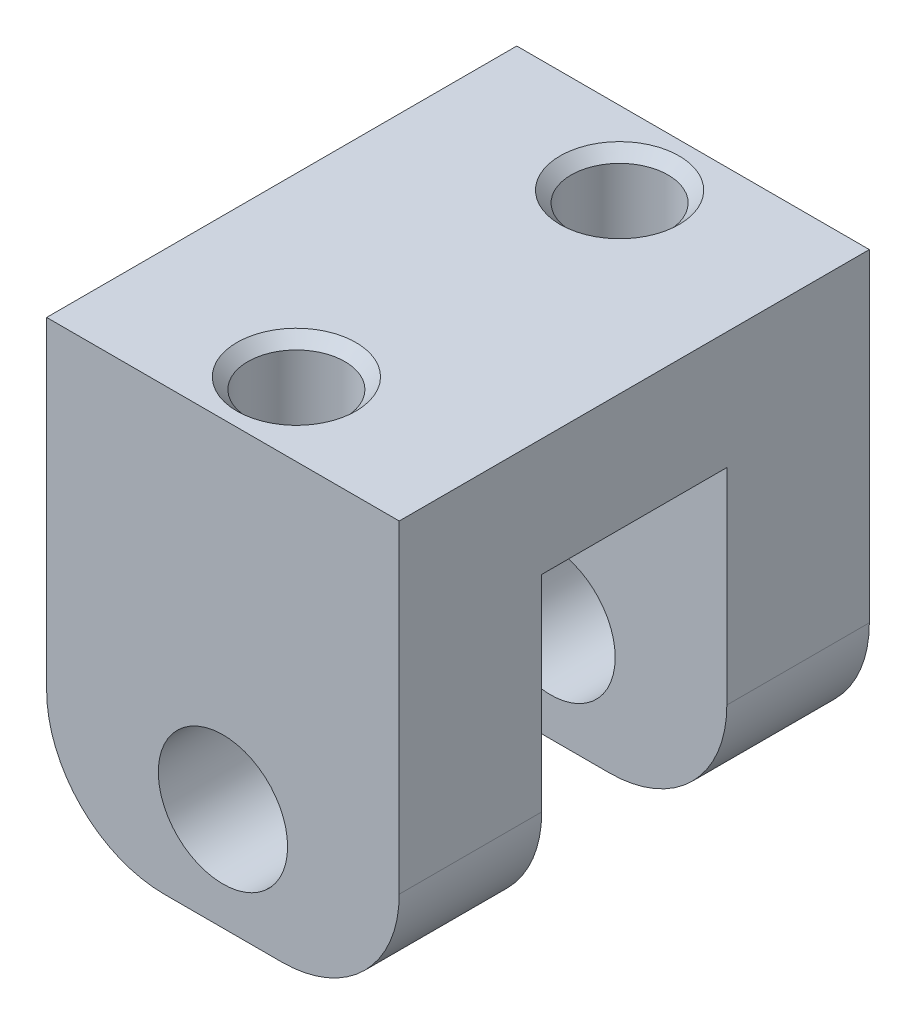
ISO-10303-21;
HEADER;
FILE_DESCRIPTION(('STEP AP214'),'2;1');
FILE_NAME('part.step','',(''),(''),'','','');
FILE_SCHEMA(('AUTOMOTIVE_DESIGN { 1 0 10303 214 1 1 1 1 }'));
ENDSEC;
DATA;
#1=APPLICATION_CONTEXT('core data for automotive mechanical design processes');
#2=APPLICATION_PROTOCOL_DEFINITION('international standard','automotive_design',2000,#1);
#3=PRODUCT_CONTEXT('',#1,'mechanical');
#4=PRODUCT('Part','Part','',(#3));
#5=PRODUCT_RELATED_PRODUCT_CATEGORY('part','',(#4));
#6=PRODUCT_DEFINITION_FORMATION('','',#4);
#7=PRODUCT_DEFINITION_CONTEXT('part definition',#1,'design');
#8=PRODUCT_DEFINITION('design','',#6,#7);
#9=PRODUCT_DEFINITION_SHAPE('','',#8);
#10=(LENGTH_UNIT() NAMED_UNIT(*) SI_UNIT(.MILLI.,.METRE.));
#11=(NAMED_UNIT(*) PLANE_ANGLE_UNIT() SI_UNIT($,.RADIAN.));
#12=(NAMED_UNIT(*) SI_UNIT($,.STERADIAN.) SOLID_ANGLE_UNIT());
#13=UNCERTAINTY_MEASURE_WITH_UNIT(LENGTH_MEASURE(1.E-05),#10,'distance_accuracy_value','');
#14=(GEOMETRIC_REPRESENTATION_CONTEXT(3) GLOBAL_UNCERTAINTY_ASSIGNED_CONTEXT((#13)) GLOBAL_UNIT_ASSIGNED_CONTEXT((#10,
#11,#12)) REPRESENTATION_CONTEXT('',''));
#15=CARTESIAN_POINT('',(0.,0.,0.));
#16=DIRECTION('',(0.,0.,1.));
#17=DIRECTION('',(1.,0.,0.));
#18=AXIS2_PLACEMENT_3D('',#15,#16,#17);
#19=CARTESIAN_POINT('',(2.,4.,8.));
#20=DIRECTION('',(0.,0.,-1.));
#21=DIRECTION('',(-1.,0.,0.));
#22=AXIS2_PLACEMENT_3D('',#19,#20,#21);
#23=CYLINDRICAL_SURFACE('',#22,4.);
#24=CARTESIAN_POINT('',(2.,4.,-3.15));
#25=DIRECTION('',(0.,0.,1.));
#26=DIRECTION('',(0.,1.,0.));
#27=AXIS2_PLACEMENT_3D('',#24,#25,#26);
#28=CIRCLE('',#27,4.);
#29=CARTESIAN_POINT('',(2.,0.,-3.15));
#30=VERTEX_POINT('',#29);
#31=CARTESIAN_POINT('',(6.,4.,-3.15));
#32=VERTEX_POINT('',#31);
#33=EDGE_CURVE('E164',#30,#32,#28,.T.);
#34=ORIENTED_EDGE('',*,*,#33,.F.);
#35=DIRECTION('',(0.,0.,1.));
#36=VECTOR('',#35,1.);
#37=CARTESIAN_POINT('',(2.,0.,0.));
#38=LINE('',#37,#36);
#39=CARTESIAN_POINT('',(2.,0.,-8.));
#40=VERTEX_POINT('',#39);
#41=EDGE_CURVE('E240',#40,#30,#38,.T.);
#42=ORIENTED_EDGE('',*,*,#41,.F.);
#43=CARTESIAN_POINT('',(2.,4.,-8.));
#44=DIRECTION('',(0.,0.,-1.));
#45=DIRECTION('',(1.,0.,0.));
#46=AXIS2_PLACEMENT_3D('',#43,#44,#45);
#47=CIRCLE('',#46,4.);
#48=CARTESIAN_POINT('',(6.,4.,-8.));
#49=VERTEX_POINT('',#48);
#50=EDGE_CURVE('E286',#49,#40,#47,.T.);
#51=ORIENTED_EDGE('',*,*,#50,.F.);
#52=DIRECTION('',(0.,0.,-1.));
#53=VECTOR('',#52,1.);
#54=CARTESIAN_POINT('',(6.,4.,8.));
#55=LINE('',#54,#53);
#56=EDGE_CURVE('E310',#32,#49,#55,.T.);
#57=ORIENTED_EDGE('',*,*,#56,.F.);
#58=EDGE_LOOP('',(#34,#42,#51,#57));
#59=FACE_BOUND('',#58,.T.);
#60=ADVANCED_FACE('F17',(#59),#23,.T.);
#61=CARTESIAN_POINT('',(2.,4.,8.));
#62=DIRECTION('',(0.,0.,-1.));
#63=DIRECTION('',(-1.,0.,0.));
#64=AXIS2_PLACEMENT_3D('',#61,#62,#63);
#65=CYLINDRICAL_SURFACE('',#64,4.);
#66=CARTESIAN_POINT('',(2.,4.,8.));
#67=DIRECTION('',(0.,0.,1.));
#68=DIRECTION('',(-1.,0.,0.));
#69=AXIS2_PLACEMENT_3D('',#66,#67,#68);
#70=CIRCLE('',#69,4.);
#71=CARTESIAN_POINT('',(2.,0.,8.));
#72=VERTEX_POINT('',#71);
#73=CARTESIAN_POINT('',(6.,4.,8.));
#74=VERTEX_POINT('',#73);
#75=EDGE_CURVE('E331',#72,#74,#70,.T.);
#76=ORIENTED_EDGE('',*,*,#75,.F.);
#77=DIRECTION('',(0.,0.,1.));
#78=VECTOR('',#77,1.);
#79=CARTESIAN_POINT('',(2.,0.,0.));
#80=LINE('',#79,#78);
#81=CARTESIAN_POINT('',(2.,0.,3.15));
#82=VERTEX_POINT('',#81);
#83=EDGE_CURVE('E372',#82,#72,#80,.T.);
#84=ORIENTED_EDGE('',*,*,#83,.F.);
#85=CARTESIAN_POINT('',(2.,4.,3.15));
#86=DIRECTION('',(0.,0.,-1.));
#87=DIRECTION('',(1.,0.,0.));
#88=AXIS2_PLACEMENT_3D('',#85,#86,#87);
#89=CIRCLE('',#88,4.);
#90=CARTESIAN_POINT('',(6.,4.,3.15));
#91=VERTEX_POINT('',#90);
#92=EDGE_CURVE('E262',#91,#82,#89,.T.);
#93=ORIENTED_EDGE('',*,*,#92,.F.);
#94=DIRECTION('',(0.,0.,-1.));
#95=VECTOR('',#94,1.);
#96=CARTESIAN_POINT('',(6.,4.,8.));
#97=LINE('',#96,#95);
#98=EDGE_CURVE('E323',#74,#91,#97,.T.);
#99=ORIENTED_EDGE('',*,*,#98,.F.);
#100=EDGE_LOOP('',(#76,#84,#93,#99));
#101=FACE_BOUND('',#100,.T.);
#102=ADVANCED_FACE('F19',(#101),#65,.T.);
#103=CARTESIAN_POINT('',(-2.,4.,8.));
#104=DIRECTION('',(0.,0.,1.));
#105=DIRECTION('',(1.,0.,0.));
#106=AXIS2_PLACEMENT_3D('',#103,#104,#105);
#107=CYLINDRICAL_SURFACE('',#106,4.);
#108=CARTESIAN_POINT('',(-2.,4.,-8.));
#109=DIRECTION('',(0.,0.,-1.));
#110=DIRECTION('',(1.,0.,0.));
#111=AXIS2_PLACEMENT_3D('',#108,#109,#110);
#112=CIRCLE('',#111,4.);
#113=CARTESIAN_POINT('',(-2.,0.,-8.));
#114=VERTEX_POINT('',#113);
#115=CARTESIAN_POINT('',(-6.,4.,-8.));
#116=VERTEX_POINT('',#115);
#117=EDGE_CURVE('E293',#114,#116,#112,.T.);
#118=ORIENTED_EDGE('',*,*,#117,.F.);
#119=DIRECTION('',(0.,0.,-1.));
#120=VECTOR('',#119,1.);
#121=CARTESIAN_POINT('',(-2.,0.,0.));
#122=LINE('',#121,#120);
#123=CARTESIAN_POINT('',(-2.,0.,-3.15));
#124=VERTEX_POINT('',#123);
#125=EDGE_CURVE('E239',#124,#114,#122,.T.);
#126=ORIENTED_EDGE('',*,*,#125,.F.);
#127=CARTESIAN_POINT('',(-2.,4.,-3.15));
#128=DIRECTION('',(0.,0.,1.));
#129=DIRECTION('',(0.,1.,0.));
#130=AXIS2_PLACEMENT_3D('',#127,#128,#129);
#131=CIRCLE('',#130,4.);
#132=CARTESIAN_POINT('',(-6.,4.,-3.15));
#133=VERTEX_POINT('',#132);
#134=EDGE_CURVE('E268',#133,#124,#131,.T.);
#135=ORIENTED_EDGE('',*,*,#134,.F.);
#136=DIRECTION('',(0.,0.,1.));
#137=VECTOR('',#136,1.);
#138=CARTESIAN_POINT('',(-6.,4.,8.));
#139=LINE('',#138,#137);
#140=EDGE_CURVE('E345',#116,#133,#139,.T.);
#141=ORIENTED_EDGE('',*,*,#140,.F.);
#142=EDGE_LOOP('',(#118,#126,#135,#141));
#143=FACE_BOUND('',#142,.T.);
#144=ADVANCED_FACE('F192',(#143),#107,.T.);
#145=CARTESIAN_POINT('',(-2.,4.,8.));
#146=DIRECTION('',(0.,0.,1.));
#147=DIRECTION('',(1.,0.,0.));
#148=AXIS2_PLACEMENT_3D('',#145,#146,#147);
#149=CYLINDRICAL_SURFACE('',#148,4.);
#150=CARTESIAN_POINT('',(-2.,4.,3.15));
#151=DIRECTION('',(0.,0.,-1.));
#152=DIRECTION('',(1.,0.,0.));
#153=AXIS2_PLACEMENT_3D('',#150,#151,#152);
#154=CIRCLE('',#153,4.);
#155=CARTESIAN_POINT('',(-2.,0.,3.15));
#156=VERTEX_POINT('',#155);
#157=CARTESIAN_POINT('',(-6.,4.,3.15));
#158=VERTEX_POINT('',#157);
#159=EDGE_CURVE('E255',#156,#158,#154,.T.);
#160=ORIENTED_EDGE('',*,*,#159,.F.);
#161=DIRECTION('',(0.,0.,-1.));
#162=VECTOR('',#161,1.);
#163=CARTESIAN_POINT('',(-2.,0.,0.));
#164=LINE('',#163,#162);
#165=CARTESIAN_POINT('',(-2.,0.,8.));
#166=VERTEX_POINT('',#165);
#167=EDGE_CURVE('E377',#166,#156,#164,.T.);
#168=ORIENTED_EDGE('',*,*,#167,.F.);
#169=CARTESIAN_POINT('',(-2.,4.,8.));
#170=DIRECTION('',(0.,0.,1.));
#171=DIRECTION('',(-1.,0.,0.));
#172=AXIS2_PLACEMENT_3D('',#169,#170,#171);
#173=CIRCLE('',#172,4.);
#174=CARTESIAN_POINT('',(-6.,4.,8.));
#175=VERTEX_POINT('',#174);
#176=EDGE_CURVE('E336',#175,#166,#173,.T.);
#177=ORIENTED_EDGE('',*,*,#176,.F.);
#178=DIRECTION('',(0.,0.,1.));
#179=VECTOR('',#178,1.);
#180=CARTESIAN_POINT('',(-6.,4.,8.));
#181=LINE('',#180,#179);
#182=EDGE_CURVE('E358',#158,#175,#181,.T.);
#183=ORIENTED_EDGE('',*,*,#182,.F.);
#184=EDGE_LOOP('',(#160,#168,#177,#183));
#185=FACE_BOUND('',#184,.T.);
#186=ADVANCED_FACE('F189',(#185),#149,.T.);
#187=CARTESIAN_POINT('',(0.,3.5,-8.));
#188=DIRECTION('',(0.,0.,1.));
#189=DIRECTION('',(1.,0.,0.));
#190=AXIS2_PLACEMENT_3D('',#187,#188,#189);
#191=CYLINDRICAL_SURFACE('',#190,2.2);
#192=CARTESIAN_POINT('',(0.,5.7,7.15));
#193=CARTESIAN_POINT('',(-0.0805428094252697,5.69999494216035,7.14999472878677));
#194=CARTESIAN_POINT('',(-0.161217168223633,5.69553010078902,7.14405447318805));
#195=CARTESIAN_POINT('',(-0.320030035915113,5.67807268009191,7.12066623024882));
#196=CARTESIAN_POINT('',(-0.398161649851904,5.66505866147839,7.10318931118494));
#197=CARTESIAN_POINT('',(-0.549158089294374,5.63175242451666,7.05791579978785));
#198=CARTESIAN_POINT('',(-0.622051776944111,5.6115044712521,7.03018193507391));
#199=CARTESIAN_POINT('',(-0.761664569072828,5.56525612393863,6.96570342139405));
#200=CARTESIAN_POINT('',(-0.828385471975964,5.53925741289031,6.92896140838713));
#201=CARTESIAN_POINT('',(-0.960812531349158,5.48054498998381,6.8439106872501));
#202=CARTESIAN_POINT('',(-1.02585255219924,5.44743239403283,6.79484593773252));
#203=CARTESIAN_POINT('',(-1.14732988444438,5.37843719671715,6.68855457890271));
#204=CARTESIAN_POINT('',(-1.20375363099448,5.34255035886469,6.63131536892018));
#205=CARTESIAN_POINT('',(-1.31820877580285,5.26298236017189,6.49705875139379));
#206=CARTESIAN_POINT('',(-1.37423636263325,5.21919940351103,6.41838595516612));
#207=CARTESIAN_POINT('',(-1.47248197993983,5.13582589130549,6.2508038863968));
#208=CARTESIAN_POINT('',(-1.51471888681385,5.09622965572043,6.16190883329966));
#209=CARTESIAN_POINT('',(-1.57168690592967,5.03974870698196,6.00654687745615));
#210=CARTESIAN_POINT('',(-1.59088241902193,5.01973526305407,5.94287023315878));
#211=CARTESIAN_POINT('',(-1.62162739821328,4.98688753565754,5.81196799173659));
#212=CARTESIAN_POINT('',(-1.63319436890794,4.97403682701915,5.74475090433773));
#213=CARTESIAN_POINT('',(-1.6479410435559,4.95754135653008,5.60759915591615));
#214=CARTESIAN_POINT('',(-1.65104450339628,4.95398029344257,5.53764551260354));
#215=CARTESIAN_POINT('',(-1.64833034566055,4.95705484953675,5.39812359803027));
#216=CARTESIAN_POINT('',(-1.64250952973084,4.96369412439925,5.32855547390382));
#217=CARTESIAN_POINT('',(-1.6235751322107,4.98464385588771,5.19948951783163));
#218=CARTESIAN_POINT('',(-1.61130735018898,4.99805872765858,5.13970999184919));
#219=CARTESIAN_POINT('',(-1.58076238232806,5.03025612129433,5.02321723340703));
#220=CARTESIAN_POINT('',(-1.56247942049289,5.04904380004846,4.96650700939404));
#221=CARTESIAN_POINT('',(-1.50736370589787,5.10315946223738,4.82211797470243));
#222=CARTESIAN_POINT('',(-1.46608163343378,5.14148214053156,4.73725954169213));
#223=CARTESIAN_POINT('',(-1.37079825645971,5.22186627959716,4.576883823744));
#224=CARTESIAN_POINT('',(-1.31676604681466,5.26393666774721,4.50138992681987));
#225=CARTESIAN_POINT('',(-1.19516764512349,5.3485683954446,4.35847127055598));
#226=CARTESIAN_POINT('',(-1.1272951307864,5.39111545403264,4.29129733243037));
#227=CARTESIAN_POINT('',(-0.979464773880545,5.4717284177907,4.16870998854072));
#228=CARTESIAN_POINT('',(-0.899530559723128,5.50980283090136,4.11327408774659));
#229=CARTESIAN_POINT('',(-0.745692288499553,5.57107698681008,4.02602112083563));
#230=CARTESIAN_POINT('',(-0.67379385720418,5.59572848039509,3.99169694636264));
#231=CARTESIAN_POINT('',(-0.523987390522293,5.63810194858642,3.93335263148975));
#232=CARTESIAN_POINT('',(-0.44608315517014,5.65582826254787,3.90932603765079));
#233=CARTESIAN_POINT('',(-0.285643855731867,5.68290147499588,3.87282130082492));
#234=CARTESIAN_POINT('',(-0.203083409546535,5.69219652268924,3.86041460316751));
#235=CARTESIAN_POINT('',(-0.0365213637766071,5.70127472025389,3.84829544289112));
#236=CARTESIAN_POINT('',(0.0474796128099975,5.70106188329949,3.8485776244351));
#237=CARTESIAN_POINT('',(0.205484639062589,5.69166801893461,3.86112195620051));
#238=CARTESIAN_POINT('',(0.279644560300747,5.68339095260441,3.87217659057754));
#239=CARTESIAN_POINT('',(0.424721737670031,5.65986452221747,3.90387115800865));
#240=CARTESIAN_POINT('',(0.495638300285988,5.64461367457988,3.92451313065835));
#241=CARTESIAN_POINT('',(0.635158457658748,5.60759813751645,3.97527628365241));
#242=CARTESIAN_POINT('',(0.703592089789755,5.58562255319213,4.00570629957014));
#243=CARTESIAN_POINT('',(0.834370379747382,5.53683683953159,4.07458970096815));
#244=CARTESIAN_POINT('',(0.896714193470045,5.51002604145275,4.11304419640371));
#245=CARTESIAN_POINT('',(1.02466278895094,5.44831061575149,4.20396157105162));
#246=CARTESIAN_POINT('',(1.08907343896857,5.41280204527541,4.2576913933812));
#247=CARTESIAN_POINT('',(1.20859172341439,5.33962848162263,4.37360962784723));
#248=CARTESIAN_POINT('',(1.26367813516534,5.30195882358135,4.4358167696627));
#249=CARTESIAN_POINT('',(1.37365295183189,5.22006041120647,4.5805648690573));
#250=CARTESIAN_POINT('',(1.42651348013576,5.17594590372111,4.66472331764153));
#251=CARTESIAN_POINT('',(1.51715559598111,5.09434650483295,4.8436960857697));
#252=CARTESIAN_POINT('',(1.5549820056707,5.05684209528066,4.93847763409943));
#253=CARTESIAN_POINT('',(1.60177307682444,5.00830765589441,5.09895589376193));
#254=CARTESIAN_POINT('',(1.61624110464295,4.99265393007021,5.16163023904262));
#255=CARTESIAN_POINT('',(1.63780674400097,4.96896261713312,5.2895777516815));
#256=CARTESIAN_POINT('',(1.64492080719163,4.96090803342257,5.35484477748248));
#257=CARTESIAN_POINT('',(1.6512685222997,4.9537336197143,5.48661198779246));
#258=CARTESIAN_POINT('',(1.65046216857788,4.95465914753473,5.55311673731053));
#259=CARTESIAN_POINT('',(1.64094572222041,4.96538093398033,5.68486252262738));
#260=CARTESIAN_POINT('',(1.63222543027043,4.97518863973232,5.75010181668699));
#261=CARTESIAN_POINT('',(1.60483226001695,5.0049908367755,5.89150602855188));
#262=CARTESIAN_POINT('',(1.58440224749522,5.02674176545708,5.96694689814606));
#263=CARTESIAN_POINT('',(1.5341658999273,5.07721259723951,6.11218833371354));
#264=CARTESIAN_POINT('',(1.50433588027502,5.10595006161623,6.18197408624201));
#265=CARTESIAN_POINT('',(1.42448810827006,5.17768125061707,6.33877269353497));
#266=CARTESIAN_POINT('',(1.37105696272567,5.22216223510216,6.42336374103133));
#267=CARTESIAN_POINT('',(1.2501579031253,5.311848611994,6.58143864947532));
#268=CARTESIAN_POINT('',(1.18267748234434,5.35705461649645,6.65491251253933));
#269=CARTESIAN_POINT('',(1.03358985943167,5.44401887833773,6.79011502651166));
#270=CARTESIAN_POINT('',(0.951870877719142,5.48574567082179,6.85174195131492));
#271=CARTESIAN_POINT('',(0.77567500882982,5.56093018634907,6.95994535625989));
#272=CARTESIAN_POINT('',(0.681229362441967,5.59440760752255,7.00655777202975));
#273=CARTESIAN_POINT('',(0.511324319392093,5.64100375086453,7.07057936308428));
#274=CARTESIAN_POINT('',(0.4384089762522,5.6572135474969,7.0925434045138));
#275=CARTESIAN_POINT('',(0.289125771432031,5.68222113967262,7.12625969287264));
#276=CARTESIAN_POINT('',(0.21276818621839,5.69103963331984,7.13804045927495));
#277=CARTESIAN_POINT('',(0.113259640848073,5.6972001887694,7.14626516363578));
#278=CARTESIAN_POINT('',(0.0906476405935323,5.69824837575288,7.14766390523836));
#279=CARTESIAN_POINT('',(0.0453605785868143,5.69964904965452,7.14953214055407));
#280=CARTESIAN_POINT('',(0.022685507271226,5.70000142457979,7.15000148467811));
#281=CARTESIAN_POINT('',(0.,5.7,7.15));
#282=B_SPLINE_CURVE_WITH_KNOTS('',3,(#192,#193,#194,#195,#196,#197,#198,#199,#200,#201,#202,
#203,#204,#205,#206,#207,#208,#209,#210,#211,#212,#213,#214,#215,#216,#217,#218,#219,#220,#221,
#222,#223,#224,#225,#226,#227,#228,#229,#230,#231,#232,#233,#234,#235,#236,#237,#238,#239,#240,
#241,#242,#243,#244,#245,#246,#247,#248,#249,#250,#251,#252,#253,#254,#255,#256,#257,#258,#259,
#260,#261,#262,#263,#264,#265,#266,#267,#268,#269,#270,#271,#272,#273,#274,#275,#276,#277,#278,
#279,#280,#281),.UNSPECIFIED.,.T.,.F.,(4,2,2,2,2,2,2,2,2,2,2,2,2,2,2,2,2,2,2,2,2,2,2,2,2,2,2,2,
2,2,2,2,2,2,2,2,2,2,2,2,2,2,2,2,4),(0.,0.241528965229246,0.483665951365568,0.724345966930719,
0.964955638734221,1.22784674449173,1.49114755245679,1.80796017476196,2.12433731462157,
2.33199470382891,2.53917392514819,2.74821346383383,2.95732793730231,3.1440957917898,
3.33104351360704,3.63494264986501,3.93958611593678,4.251894723319,4.5635992874306,
4.81279155507028,5.06182742607429,5.31238463983588,5.56283609713274,5.78810305713193,
6.01341796204393,6.24668483432048,6.47998399375295,6.75224420290054,7.02511599883996,
7.34985455617541,7.67361755435123,7.87148077565225,8.06890039025628,8.26731767240215,
8.46599103420239,8.70803638056148,8.95069653653913,9.27753471321344,9.60466509629982,
9.93448994441914,10.2635194230048,10.4961526729579,10.7281322751158,10.7961498356658,
10.8641783429406),.UNSPECIFIED.);
#283=CARTESIAN_POINT('',(0.,5.7,7.15));
#284=VERTEX_POINT('',#283);
#285=EDGE_CURVE('E21',#284,#284,#282,.T.);
#286=ORIENTED_EDGE('',*,*,#285,.F.);
#287=EDGE_LOOP('',(#286));
#288=FACE_BOUND('',#287,.T.);
#289=CARTESIAN_POINT('',(0.,3.5,8.));
#290=DIRECTION('',(0.,0.,1.));
#291=DIRECTION('',(1.,0.,0.));
#292=AXIS2_PLACEMENT_3D('',#289,#290,#291);
#293=CIRCLE('',#292,2.2);
#294=CARTESIAN_POINT('',(2.2,3.5,8.));
#295=VERTEX_POINT('',#294);
#296=EDGE_CURVE('E327',#295,#295,#293,.T.);
#297=ORIENTED_EDGE('',*,*,#296,.T.);
#298=EDGE_LOOP('',(#297));
#299=FACE_BOUND('',#298,.T.);
#300=CARTESIAN_POINT('',(0.,3.5,3.15));
#301=DIRECTION('',(0.,0.,1.));
#302=DIRECTION('',(1.,0.,0.));
#303=AXIS2_PLACEMENT_3D('',#300,#301,#302);
#304=CIRCLE('',#303,2.2);
#305=CARTESIAN_POINT('',(2.2,3.5,3.15));
#306=VERTEX_POINT('',#305);
#307=EDGE_CURVE('E265',#306,#306,#304,.T.);
#308=ORIENTED_EDGE('',*,*,#307,.F.);
#309=EDGE_LOOP('',(#308));
#310=FACE_BOUND('',#309,.T.);
#311=ADVANCED_FACE('F182',(#288,#299,#310),#191,.F.);
#312=CARTESIAN_POINT('',(0.,3.5,-8.));
#313=DIRECTION('',(0.,0.,1.));
#314=DIRECTION('',(1.,0.,0.));
#315=AXIS2_PLACEMENT_3D('',#312,#313,#314);
#316=CYLINDRICAL_SURFACE('',#315,2.2);
#317=CARTESIAN_POINT('',(0.,5.7,-3.85));
#318=CARTESIAN_POINT('',(-0.0805428094252718,5.69999494216035,-3.85000527121323));
#319=CARTESIAN_POINT('',(-0.161217168223636,5.69553010078902,-3.85594552681195));
#320=CARTESIAN_POINT('',(-0.320030035915116,5.67807268009191,-3.87933376975118));
#321=CARTESIAN_POINT('',(-0.398161649851906,5.66505866147839,-3.89681068881506));
#322=CARTESIAN_POINT('',(-0.549158089294376,5.63175242451666,-3.94208420021215));
#323=CARTESIAN_POINT('',(-0.622051776944113,5.6115044712521,-3.96981806492609));
#324=CARTESIAN_POINT('',(-0.761664569072831,5.56525612393863,-4.03429657860595));
#325=CARTESIAN_POINT('',(-0.828385471975967,5.53925741289031,-4.07103859161287));
#326=CARTESIAN_POINT('',(-0.960812531349161,5.48054498998381,-4.1560893127499));
#327=CARTESIAN_POINT('',(-1.02585255219924,5.44743239403283,-4.20515406226748));
#328=CARTESIAN_POINT('',(-1.14732988444438,5.37843719671715,-4.31144542109729));
#329=CARTESIAN_POINT('',(-1.20375363099448,5.34255035886469,-4.36868463107982));
#330=CARTESIAN_POINT('',(-1.31820877580285,5.26298236017189,-4.50294124860621));
#331=CARTESIAN_POINT('',(-1.37423636263325,5.21919940351102,-4.58161404483387));
#332=CARTESIAN_POINT('',(-1.47248197993983,5.13582589130548,-4.7491961136032));
#333=CARTESIAN_POINT('',(-1.51471888681384,5.09622965572043,-4.83809116670034));
#334=CARTESIAN_POINT('',(-1.57168690592967,5.03974870698196,-4.99345312254385));
#335=CARTESIAN_POINT('',(-1.59088241902193,5.01973526305407,-5.05712976684122));
#336=CARTESIAN_POINT('',(-1.62162739821329,4.98688753565753,-5.18803200826341));
#337=CARTESIAN_POINT('',(-1.63319436890794,4.97403682701914,-5.25524909566227));
#338=CARTESIAN_POINT('',(-1.6479410435559,4.95754135653008,-5.39240084408385));
#339=CARTESIAN_POINT('',(-1.65104450339628,4.95398029344256,-5.46235448739646));
#340=CARTESIAN_POINT('',(-1.64833034566056,4.95705484953675,-5.60187640196973));
#341=CARTESIAN_POINT('',(-1.64250952973084,4.96369412439924,-5.67144452609618));
#342=CARTESIAN_POINT('',(-1.6235751322107,4.9846438558877,-5.80051048216837));
#343=CARTESIAN_POINT('',(-1.61130735018899,4.99805872765858,-5.8602900081508));
#344=CARTESIAN_POINT('',(-1.58076238232806,5.03025612129433,-5.97678276659296));
#345=CARTESIAN_POINT('',(-1.56247942049289,5.04904380004845,-6.03349299060595));
#346=CARTESIAN_POINT('',(-1.50736370589788,5.10315946223736,-6.17788202529756));
#347=CARTESIAN_POINT('',(-1.46608163343378,5.14148214053156,-6.26274045830786));
#348=CARTESIAN_POINT('',(-1.37079825645971,5.22186627959715,-6.42311617625599));
#349=CARTESIAN_POINT('',(-1.31676604681466,5.2639366677472,-6.49861007318012));
#350=CARTESIAN_POINT('',(-1.19516764512349,5.34856839544459,-6.64152872944402));
#351=CARTESIAN_POINT('',(-1.1272951307864,5.39111545403263,-6.70870266756963));
#352=CARTESIAN_POINT('',(-0.979464773880552,5.4717284177907,-6.83129001145928));
#353=CARTESIAN_POINT('',(-0.899530559723134,5.50980283090136,-6.88672591225341));
#354=CARTESIAN_POINT('',(-0.745692288499558,5.57107698681007,-6.97397887916436));
#355=CARTESIAN_POINT('',(-0.673793857204185,5.59572848039509,-7.00830305363736));
#356=CARTESIAN_POINT('',(-0.523987390522299,5.63810194858642,-7.06664736851025));
#357=CARTESIAN_POINT('',(-0.446083155170146,5.65582826254787,-7.09067396234921));
#358=CARTESIAN_POINT('',(-0.285643855731872,5.68290147499588,-7.12717869917508));
#359=CARTESIAN_POINT('',(-0.203083409546539,5.69219652268924,-7.13958539683249));
#360=CARTESIAN_POINT('',(-0.0365213637766114,5.70127472025389,-7.15170455710888));
#361=CARTESIAN_POINT('',(0.047479612809993,5.70106188329949,-7.1514223755649));
#362=CARTESIAN_POINT('',(0.205484639062585,5.69166801893461,-7.13887804379949));
#363=CARTESIAN_POINT('',(0.279644560300743,5.68339095260441,-7.12782340942246));
#364=CARTESIAN_POINT('',(0.424721737670026,5.65986452221746,-7.09612884199135));
#365=CARTESIAN_POINT('',(0.495638300285983,5.64461367457988,-7.07548686934165));
#366=CARTESIAN_POINT('',(0.635158457658743,5.60759813751645,-7.02472371634759));
#367=CARTESIAN_POINT('',(0.70359208978975,5.58562255319213,-6.99429370042987));
#368=CARTESIAN_POINT('',(0.834370379747378,5.53683683953159,-6.92541029903185));
#369=CARTESIAN_POINT('',(0.89671419347004,5.51002604145275,-6.88695580359629));
#370=CARTESIAN_POINT('',(1.02466278895094,5.44831061575149,-6.79603842894838));
#371=CARTESIAN_POINT('',(1.08907343896857,5.41280204527541,-6.7423086066188));
#372=CARTESIAN_POINT('',(1.20859172341439,5.33962848162263,-6.62639037215277));
#373=CARTESIAN_POINT('',(1.26367813516534,5.30195882358135,-6.5641832303373));
#374=CARTESIAN_POINT('',(1.37365295183188,5.22006041120647,-6.4194351309427));
#375=CARTESIAN_POINT('',(1.42651348013575,5.17594590372111,-6.33527668235847));
#376=CARTESIAN_POINT('',(1.51715559598111,5.09434650483296,-6.1563039142303));
#377=CARTESIAN_POINT('',(1.55498200567071,5.05684209528067,-6.06152236590057));
#378=CARTESIAN_POINT('',(1.60177307682444,5.00830765589442,-5.90104410623807));
#379=CARTESIAN_POINT('',(1.61624110464295,4.99265393007022,-5.83836976095738));
#380=CARTESIAN_POINT('',(1.63780674400097,4.96896261713312,-5.7104222483185));
#381=CARTESIAN_POINT('',(1.64492080719163,4.96090803342257,-5.64515522251752));
#382=CARTESIAN_POINT('',(1.6512685222997,4.9537336197143,-5.51338801220754));
#383=CARTESIAN_POINT('',(1.65046216857788,4.95465914753473,-5.44688326268947));
#384=CARTESIAN_POINT('',(1.64094572222041,4.96538093398033,-5.31513747737262));
#385=CARTESIAN_POINT('',(1.63222543027042,4.97518863973232,-5.24989818331301));
#386=CARTESIAN_POINT('',(1.60483226001694,5.0049908367755,-5.10849397144812));
#387=CARTESIAN_POINT('',(1.58440224749522,5.02674176545708,-5.03305310185394));
#388=CARTESIAN_POINT('',(1.5341658999273,5.07721259723951,-4.88781166628647));
#389=CARTESIAN_POINT('',(1.50433588027502,5.10595006161623,-4.81802591375799));
#390=CARTESIAN_POINT('',(1.42448810827006,5.17768125061707,-4.66122730646503));
#391=CARTESIAN_POINT('',(1.37105696272567,5.22216223510216,-4.57663625896867));
#392=CARTESIAN_POINT('',(1.2501579031253,5.311848611994,-4.41856135052468));
#393=CARTESIAN_POINT('',(1.18267748234435,5.35705461649645,-4.34508748746067));
#394=CARTESIAN_POINT('',(1.03358985943168,5.44401887833773,-4.20988497348834));
#395=CARTESIAN_POINT('',(0.951870877719143,5.48574567082179,-4.14825804868508));
#396=CARTESIAN_POINT('',(0.77567500882982,5.56093018634907,-4.04005464374011));
#397=CARTESIAN_POINT('',(0.681229362441969,5.59440760752255,-3.99344222797025));
#398=CARTESIAN_POINT('',(0.511324319392095,5.64100375086453,-3.92942063691572));
#399=CARTESIAN_POINT('',(0.438408976252202,5.6572135474969,-3.90745659548621));
#400=CARTESIAN_POINT('',(0.289125771432032,5.68222113967262,-3.87374030712736));
#401=CARTESIAN_POINT('',(0.212768186218392,5.69103963331984,-3.86195954072504));
#402=CARTESIAN_POINT('',(0.113259640848074,5.6972001887694,-3.85373483636422));
#403=CARTESIAN_POINT('',(0.0906476405935326,5.69824837575288,-3.85233609476164));
#404=CARTESIAN_POINT('',(0.0453605785868134,5.69964904965452,-3.85046785944593));
#405=CARTESIAN_POINT('',(0.0226855072712245,5.70000142457979,-3.84999851532189));
#406=CARTESIAN_POINT('',(0.,5.7,-3.85));
#407=B_SPLINE_CURVE_WITH_KNOTS('',3,(#317,#318,#319,#320,#321,#322,#323,#324,#325,#326,#327,
#328,#329,#330,#331,#332,#333,#334,#335,#336,#337,#338,#339,#340,#341,#342,#343,#344,#345,#346,
#347,#348,#349,#350,#351,#352,#353,#354,#355,#356,#357,#358,#359,#360,#361,#362,#363,#364,#365,
#366,#367,#368,#369,#370,#371,#372,#373,#374,#375,#376,#377,#378,#379,#380,#381,#382,#383,#384,
#385,#386,#387,#388,#389,#390,#391,#392,#393,#394,#395,#396,#397,#398,#399,#400,#401,#402,#403,
#404,#405,#406),.UNSPECIFIED.,.T.,.F.,(4,2,2,2,2,2,2,2,2,2,2,2,2,2,2,2,2,2,2,2,2,2,2,2,2,2,2,2,
2,2,2,2,2,2,2,2,2,2,2,2,2,2,2,2,4),(0.,0.241528965229246,0.483665951365568,0.72434596693072,
0.964955638734222,1.22784674449173,1.49114755245679,1.80796017476196,2.12433731462157,
2.33199470382892,2.53917392514819,2.74821346383383,2.95732793730231,3.1440957917898,
3.33104351360703,3.634942649865,3.93958611593678,4.25189472331899,4.56359928743059,
4.81279155507027,5.06182742607429,5.31238463983588,5.56283609713274,5.78810305713193,
6.01341796204393,6.24668483432047,6.47998399375295,6.75224420290054,7.02511599883996,
7.34985455617541,7.67361755435123,7.87148077565225,8.06890039025628,8.26731767240215,
8.46599103420239,8.70803638056147,8.95069653653913,9.27753471321344,9.60466509629982,
9.93448994441914,10.2635194230048,10.4961526729579,10.7281322751158,10.7961498356658,
10.8641783429406),.UNSPECIFIED.);
#408=CARTESIAN_POINT('',(0.,5.7,-3.85));
#409=VERTEX_POINT('',#408);
#410=EDGE_CURVE('E11',#409,#409,#407,.T.);
#411=ORIENTED_EDGE('',*,*,#410,.F.);
#412=EDGE_LOOP('',(#411));
#413=FACE_BOUND('',#412,.T.);
#414=CARTESIAN_POINT('',(0.,3.5,-8.));
#415=DIRECTION('',(0.,0.,1.));
#416=DIRECTION('',(1.,0.,0.));
#417=AXIS2_PLACEMENT_3D('',#414,#415,#416);
#418=CIRCLE('',#417,2.2);
#419=CARTESIAN_POINT('',(2.2,3.5,-8.));
#420=VERTEX_POINT('',#419);
#421=EDGE_CURVE('E283',#420,#420,#418,.T.);
#422=ORIENTED_EDGE('',*,*,#421,.F.);
#423=EDGE_LOOP('',(#422));
#424=FACE_BOUND('',#423,.T.);
#425=CARTESIAN_POINT('',(0.,3.5,-3.15));
#426=DIRECTION('',(0.,0.,-1.));
#427=DIRECTION('',(0.,1.,0.));
#428=AXIS2_PLACEMENT_3D('',#425,#426,#427);
#429=CIRCLE('',#428,2.2);
#430=CARTESIAN_POINT('',(0.,5.7,-3.15));
#431=VERTEX_POINT('',#430);
#432=EDGE_CURVE('E157',#431,#431,#429,.T.);
#433=ORIENTED_EDGE('',*,*,#432,.F.);
#434=EDGE_LOOP('',(#433));
#435=FACE_BOUND('',#434,.T.);
#436=ADVANCED_FACE('F178',(#413,#424,#435),#316,.F.);
#437=CARTESIAN_POINT('',(0.,15.,-5.5));
#438=DIRECTION('',(0.,1.,0.));
#439=DIRECTION('',(0.,0.,1.));
#440=AXIS2_PLACEMENT_3D('',#437,#438,#439);
#441=CONICAL_SURFACE('',#440,2.025,0.785398163397446);
#442=CARTESIAN_POINT('',(0.,14.625,-5.5));
#443=DIRECTION('',(0.,1.,0.));
#444=DIRECTION('',(0.,0.,1.));
#445=AXIS2_PLACEMENT_3D('',#442,#443,#444);
#446=CIRCLE('',#445,1.65);
#447=CARTESIAN_POINT('',(0.,14.625,-3.85));
#448=VERTEX_POINT('',#447);
#449=EDGE_CURVE('E32',#448,#448,#446,.T.);
#450=ORIENTED_EDGE('',*,*,#449,.F.);
#451=EDGE_LOOP('',(#450));
#452=FACE_BOUND('',#451,.T.);
#453=CARTESIAN_POINT('',(0.,15.,-5.5));
#454=DIRECTION('',(0.,1.,0.));
#455=DIRECTION('',(0.,0.,1.));
#456=AXIS2_PLACEMENT_3D('',#453,#454,#455);
#457=CIRCLE('',#456,2.025);
#458=CARTESIAN_POINT('',(0.,15.,-3.475));
#459=VERTEX_POINT('',#458);
#460=EDGE_CURVE('E251',#459,#459,#457,.T.);
#461=ORIENTED_EDGE('',*,*,#460,.T.);
#462=EDGE_LOOP('',(#461));
#463=FACE_BOUND('',#462,.T.);
#464=ADVANCED_FACE('F181',(#452,#463),#441,.F.);
#465=CARTESIAN_POINT('',(0.,15.,-5.5));
#466=DIRECTION('',(0.,1.,0.));
#467=DIRECTION('',(0.,0.,1.));
#468=AXIS2_PLACEMENT_3D('',#465,#466,#467);
#469=CYLINDRICAL_SURFACE('',#468,1.65);
#470=ORIENTED_EDGE('',*,*,#410,.T.);
#471=EDGE_LOOP('',(#470));
#472=FACE_BOUND('',#471,.T.);
#473=ORIENTED_EDGE('',*,*,#449,.T.);
#474=EDGE_LOOP('',(#473));
#475=FACE_BOUND('',#474,.T.);
#476=ADVANCED_FACE('F174',(#472,#475),#469,.F.);
#477=CARTESIAN_POINT('',(0.,15.,5.5));
#478=DIRECTION('',(0.,1.,0.));
#479=DIRECTION('',(0.,0.,1.));
#480=AXIS2_PLACEMENT_3D('',#477,#478,#479);
#481=CONICAL_SURFACE('',#480,2.025,0.785398163397446);
#482=CARTESIAN_POINT('',(0.,14.625,5.5));
#483=DIRECTION('',(0.,1.,0.));
#484=DIRECTION('',(0.,0.,1.));
#485=AXIS2_PLACEMENT_3D('',#482,#483,#484);
#486=CIRCLE('',#485,1.65);
#487=CARTESIAN_POINT('',(0.,14.625,7.15));
#488=VERTEX_POINT('',#487);
#489=EDGE_CURVE('E153',#488,#488,#486,.T.);
#490=ORIENTED_EDGE('',*,*,#489,.F.);
#491=EDGE_LOOP('',(#490));
#492=FACE_BOUND('',#491,.T.);
#493=CARTESIAN_POINT('',(0.,15.,5.5));
#494=DIRECTION('',(0.,1.,0.));
#495=DIRECTION('',(0.,0.,1.));
#496=AXIS2_PLACEMENT_3D('',#493,#494,#495);
#497=CIRCLE('',#496,2.025);
#498=CARTESIAN_POINT('',(0.,15.,7.525));
#499=VERTEX_POINT('',#498);
#500=EDGE_CURVE('E243',#499,#499,#497,.T.);
#501=ORIENTED_EDGE('',*,*,#500,.T.);
#502=EDGE_LOOP('',(#501));
#503=FACE_BOUND('',#502,.T.);
#504=ADVANCED_FACE('F448',(#492,#503),#481,.F.);
#505=CARTESIAN_POINT('',(0.,15.,5.5));
#506=DIRECTION('',(0.,1.,0.));
#507=DIRECTION('',(0.,0.,1.));
#508=AXIS2_PLACEMENT_3D('',#505,#506,#507);
#509=CYLINDRICAL_SURFACE('',#508,1.65);
#510=ORIENTED_EDGE('',*,*,#285,.T.);
#511=EDGE_LOOP('',(#510));
#512=FACE_BOUND('',#511,.T.);
#513=ORIENTED_EDGE('',*,*,#489,.T.);
#514=EDGE_LOOP('',(#513));
#515=FACE_BOUND('',#514,.T.);
#516=ADVANCED_FACE('F154',(#512,#515),#509,.F.);
#517=CARTESIAN_POINT('',(-6.,11.,-3.15));
#518=DIRECTION('',(0.,0.,-1.));
#519=DIRECTION('',(-1.,0.,0.));
#520=AXIS2_PLACEMENT_3D('',#517,#518,#519);
#521=PLANE('',#520);
#522=ORIENTED_EDGE('',*,*,#432,.T.);
#523=EDGE_LOOP('',(#522));
#524=FACE_BOUND('',#523,.T.);
#525=DIRECTION('',(0.,1.,0.));
#526=VECTOR('',#525,1.);
#527=CARTESIAN_POINT('',(-6.,11.,-3.15));
#528=LINE('',#527,#526);
#529=CARTESIAN_POINT('',(-6.,11.,-3.15));
#530=VERTEX_POINT('',#529);
#531=EDGE_CURVE('E341',#133,#530,#528,.T.);
#532=ORIENTED_EDGE('',*,*,#531,.F.);
#533=ORIENTED_EDGE('',*,*,#134,.T.);
#534=DIRECTION('',(1.,0.,0.));
#535=VECTOR('',#534,1.);
#536=CARTESIAN_POINT('',(-6.,0.,-3.15));
#537=LINE('',#536,#535);
#538=EDGE_CURVE('E236',#124,#30,#537,.T.);
#539=ORIENTED_EDGE('',*,*,#538,.T.);
#540=ORIENTED_EDGE('',*,*,#33,.T.);
#541=DIRECTION('',(0.,1.,0.));
#542=VECTOR('',#541,1.);
#543=CARTESIAN_POINT('',(6.,11.,-3.15));
#544=LINE('',#543,#542);
#545=CARTESIAN_POINT('',(6.,11.,-3.15));
#546=VERTEX_POINT('',#545);
#547=EDGE_CURVE('E311',#32,#546,#544,.T.);
#548=ORIENTED_EDGE('',*,*,#547,.T.);
#549=DIRECTION('',(1.,0.,0.));
#550=VECTOR('',#549,1.);
#551=CARTESIAN_POINT('',(-6.,11.,-3.15));
#552=LINE('',#551,#550);
#553=EDGE_CURVE('E266',#530,#546,#552,.T.);
#554=ORIENTED_EDGE('',*,*,#553,.F.);
#555=EDGE_LOOP('',(#532,#533,#539,#540,#548,#554));
#556=FACE_BOUND('',#555,.T.);
#557=ADVANCED_FACE('F209',(#524,#556),#521,.F.);
#558=CARTESIAN_POINT('',(-6.,11.,-3.15));
#559=DIRECTION('',(0.,1.,0.));
#560=DIRECTION('',(0.,0.,-1.));
#561=AXIS2_PLACEMENT_3D('',#558,#559,#560);
#562=PLANE('',#561);
#563=DIRECTION('',(0.,0.,1.));
#564=VECTOR('',#563,1.);
#565=CARTESIAN_POINT('',(6.,11.,-3.15));
#566=LINE('',#565,#564);
#567=CARTESIAN_POINT('',(6.,11.,3.15));
#568=VERTEX_POINT('',#567);
#569=EDGE_CURVE('E314',#546,#568,#566,.T.);
#570=ORIENTED_EDGE('',*,*,#569,.T.);
#571=DIRECTION('',(1.,0.,0.));
#572=VECTOR('',#571,1.);
#573=CARTESIAN_POINT('',(-6.,11.,3.15));
#574=LINE('',#573,#572);
#575=CARTESIAN_POINT('',(-6.,11.,3.15));
#576=VERTEX_POINT('',#575);
#577=EDGE_CURVE('E259',#576,#568,#574,.T.);
#578=ORIENTED_EDGE('',*,*,#577,.F.);
#579=DIRECTION('',(0.,0.,1.));
#580=VECTOR('',#579,1.);
#581=CARTESIAN_POINT('',(-6.,11.,-3.15));
#582=LINE('',#581,#580);
#583=EDGE_CURVE('E340',#530,#576,#582,.T.);
#584=ORIENTED_EDGE('',*,*,#583,.F.);
#585=ORIENTED_EDGE('',*,*,#553,.T.);
#586=EDGE_LOOP('',(#570,#578,#584,#585));
#587=FACE_BOUND('',#586,.T.);
#588=ADVANCED_FACE('F212',(#587),#562,.F.);
#589=CARTESIAN_POINT('',(-6.,11.,3.15));
#590=DIRECTION('',(0.,0.,1.));
#591=DIRECTION('',(1.,0.,0.));
#592=AXIS2_PLACEMENT_3D('',#589,#590,#591);
#593=PLANE('',#592);
#594=ORIENTED_EDGE('',*,*,#307,.T.);
#595=EDGE_LOOP('',(#594));
#596=FACE_BOUND('',#595,.T.);
#597=DIRECTION('',(1.,0.,0.));
#598=VECTOR('',#597,1.);
#599=CARTESIAN_POINT('',(-6.,0.,3.15));
#600=LINE('',#599,#598);
#601=EDGE_CURVE('E376',#156,#82,#600,.T.);
#602=ORIENTED_EDGE('',*,*,#601,.F.);
#603=ORIENTED_EDGE('',*,*,#159,.T.);
#604=DIRECTION('',(0.,-1.,0.));
#605=VECTOR('',#604,1.);
#606=CARTESIAN_POINT('',(-6.,11.,3.15));
#607=LINE('',#606,#605);
#608=EDGE_CURVE('E365',#576,#158,#607,.T.);
#609=ORIENTED_EDGE('',*,*,#608,.F.);
#610=ORIENTED_EDGE('',*,*,#577,.T.);
#611=DIRECTION('',(0.,-1.,0.));
#612=VECTOR('',#611,1.);
#613=CARTESIAN_POINT('',(6.,11.,3.15));
#614=LINE('',#613,#612);
#615=EDGE_CURVE('E319',#568,#91,#614,.T.);
#616=ORIENTED_EDGE('',*,*,#615,.T.);
#617=ORIENTED_EDGE('',*,*,#92,.T.);
#618=EDGE_LOOP('',(#602,#603,#609,#610,#616,#617));
#619=FACE_BOUND('',#618,.T.);
#620=ADVANCED_FACE('F216',(#596,#619),#593,.F.);
#621=CARTESIAN_POINT('',(0.,0.,0.));
#622=DIRECTION('',(0.,1.,0.));
#623=DIRECTION('',(1.,0.,0.));
#624=AXIS2_PLACEMENT_3D('',#621,#622,#623);
#625=PLANE('',#624);
#626=ORIENTED_EDGE('',*,*,#538,.F.);
#627=ORIENTED_EDGE('',*,*,#125,.T.);
#628=DIRECTION('',(-1.,0.,0.));
#629=VECTOR('',#628,1.);
#630=CARTESIAN_POINT('',(6.,0.,-8.));
#631=LINE('',#630,#629);
#632=EDGE_CURVE('E296',#40,#114,#631,.T.);
#633=ORIENTED_EDGE('',*,*,#632,.F.);
#634=ORIENTED_EDGE('',*,*,#41,.T.);
#635=EDGE_LOOP('',(#626,#627,#633,#634));
#636=FACE_BOUND('',#635,.T.);
#637=ADVANCED_FACE('F220',(#636),#625,.F.);
#638=CARTESIAN_POINT('',(0.,15.,0.));
#639=DIRECTION('',(0.,1.,0.));
#640=DIRECTION('',(1.,0.,0.));
#641=AXIS2_PLACEMENT_3D('',#638,#639,#640);
#642=PLANE('',#641);
#643=ORIENTED_EDGE('',*,*,#500,.F.);
#644=EDGE_LOOP('',(#643));
#645=FACE_BOUND('',#644,.T.);
#646=ORIENTED_EDGE('',*,*,#460,.F.);
#647=EDGE_LOOP('',(#646));
#648=FACE_BOUND('',#647,.T.);
#649=DIRECTION('',(0.,0.,1.));
#650=VECTOR('',#649,1.);
#651=CARTESIAN_POINT('',(-6.,15.,8.));
#652=LINE('',#651,#650);
#653=CARTESIAN_POINT('',(-6.,15.,-8.));
#654=VERTEX_POINT('',#653);
#655=CARTESIAN_POINT('',(-6.,15.,8.));
#656=VERTEX_POINT('',#655);
#657=EDGE_CURVE('E357',#654,#656,#652,.T.);
#658=ORIENTED_EDGE('',*,*,#657,.T.);
#659=DIRECTION('',(1.,0.,0.));
#660=VECTOR('',#659,1.);
#661=CARTESIAN_POINT('',(6.,15.,8.));
#662=LINE('',#661,#660);
#663=CARTESIAN_POINT('',(6.,15.,8.));
#664=VERTEX_POINT('',#663);
#665=EDGE_CURVE('E330',#656,#664,#662,.T.);
#666=ORIENTED_EDGE('',*,*,#665,.T.);
#667=DIRECTION('',(0.,0.,-1.));
#668=VECTOR('',#667,1.);
#669=CARTESIAN_POINT('',(6.,15.,8.));
#670=LINE('',#669,#668);
#671=CARTESIAN_POINT('',(6.,15.,-8.));
#672=VERTEX_POINT('',#671);
#673=EDGE_CURVE('E300',#664,#672,#670,.T.);
#674=ORIENTED_EDGE('',*,*,#673,.T.);
#675=DIRECTION('',(-1.,0.,0.));
#676=VECTOR('',#675,1.);
#677=CARTESIAN_POINT('',(6.,15.,-8.));
#678=LINE('',#677,#676);
#679=EDGE_CURVE('E290',#672,#654,#678,.T.);
#680=ORIENTED_EDGE('',*,*,#679,.T.);
#681=EDGE_LOOP('',(#658,#666,#674,#680));
#682=FACE_BOUND('',#681,.T.);
#683=ADVANCED_FACE('F222',(#645,#648,#682),#642,.T.);
#684=CARTESIAN_POINT('',(6.,15.,-8.));
#685=DIRECTION('',(0.,0.,1.));
#686=DIRECTION('',(1.,0.,0.));
#687=AXIS2_PLACEMENT_3D('',#684,#685,#686);
#688=PLANE('',#687);
#689=ORIENTED_EDGE('',*,*,#421,.T.);
#690=EDGE_LOOP('',(#689));
#691=FACE_BOUND('',#690,.T.);
#692=ORIENTED_EDGE('',*,*,#632,.T.);
#693=ORIENTED_EDGE('',*,*,#117,.T.);
#694=DIRECTION('',(0.,-1.,0.));
#695=VECTOR('',#694,1.);
#696=CARTESIAN_POINT('',(-6.,15.,-8.));
#697=LINE('',#696,#695);
#698=EDGE_CURVE('E349',#654,#116,#697,.T.);
#699=ORIENTED_EDGE('',*,*,#698,.F.);
#700=ORIENTED_EDGE('',*,*,#679,.F.);
#701=DIRECTION('',(0.,-1.,0.));
#702=VECTOR('',#701,1.);
#703=CARTESIAN_POINT('',(6.,15.,-8.));
#704=LINE('',#703,#702);
#705=EDGE_CURVE('E306',#672,#49,#704,.T.);
#706=ORIENTED_EDGE('',*,*,#705,.T.);
#707=ORIENTED_EDGE('',*,*,#50,.T.);
#708=EDGE_LOOP('',(#692,#693,#699,#700,#706,#707));
#709=FACE_BOUND('',#708,.T.);
#710=ADVANCED_FACE('F229',(#691,#709),#688,.F.);
#711=CARTESIAN_POINT('',(6.,15.,8.));
#712=DIRECTION('',(-1.,0.,0.));
#713=DIRECTION('',(0.,0.,1.));
#714=AXIS2_PLACEMENT_3D('',#711,#712,#713);
#715=PLANE('',#714);
#716=DIRECTION('',(0.,-1.,0.));
#717=VECTOR('',#716,1.);
#718=CARTESIAN_POINT('',(6.,15.,8.));
#719=LINE('',#718,#717);
#720=EDGE_CURVE('E335',#664,#74,#719,.T.);
#721=ORIENTED_EDGE('',*,*,#720,.T.);
#722=ORIENTED_EDGE('',*,*,#98,.T.);
#723=ORIENTED_EDGE('',*,*,#615,.F.);
#724=ORIENTED_EDGE('',*,*,#569,.F.);
#725=ORIENTED_EDGE('',*,*,#547,.F.);
#726=ORIENTED_EDGE('',*,*,#56,.T.);
#727=ORIENTED_EDGE('',*,*,#705,.F.);
#728=ORIENTED_EDGE('',*,*,#673,.F.);
#729=EDGE_LOOP('',(#721,#722,#723,#724,#725,#726,#727,#728));
#730=FACE_BOUND('',#729,.T.);
#731=ADVANCED_FACE('F455',(#730),#715,.F.);
#732=CARTESIAN_POINT('',(6.,15.,8.));
#733=DIRECTION('',(0.,0.,-1.));
#734=DIRECTION('',(-1.,0.,0.));
#735=AXIS2_PLACEMENT_3D('',#732,#733,#734);
#736=PLANE('',#735);
#737=ORIENTED_EDGE('',*,*,#296,.F.);
#738=EDGE_LOOP('',(#737));
#739=FACE_BOUND('',#738,.T.);
#740=DIRECTION('',(0.,-1.,0.));
#741=VECTOR('',#740,1.);
#742=CARTESIAN_POINT('',(-6.,15.,8.));
#743=LINE('',#742,#741);
#744=EDGE_CURVE('E353',#656,#175,#743,.T.);
#745=ORIENTED_EDGE('',*,*,#744,.T.);
#746=ORIENTED_EDGE('',*,*,#176,.T.);
#747=DIRECTION('',(1.,0.,0.));
#748=VECTOR('',#747,1.);
#749=CARTESIAN_POINT('',(6.,0.,8.));
#750=LINE('',#749,#748);
#751=EDGE_CURVE('E381',#166,#72,#750,.T.);
#752=ORIENTED_EDGE('',*,*,#751,.T.);
#753=ORIENTED_EDGE('',*,*,#75,.T.);
#754=ORIENTED_EDGE('',*,*,#720,.F.);
#755=ORIENTED_EDGE('',*,*,#665,.F.);
#756=EDGE_LOOP('',(#745,#746,#752,#753,#754,#755));
#757=FACE_BOUND('',#756,.T.);
#758=ADVANCED_FACE('F463',(#739,#757),#736,.F.);
#759=CARTESIAN_POINT('',(-6.,15.,8.));
#760=DIRECTION('',(1.,0.,0.));
#761=DIRECTION('',(0.,1.,0.));
#762=AXIS2_PLACEMENT_3D('',#759,#760,#761);
#763=PLANE('',#762);
#764=ORIENTED_EDGE('',*,*,#608,.T.);
#765=ORIENTED_EDGE('',*,*,#182,.T.);
#766=ORIENTED_EDGE('',*,*,#744,.F.);
#767=ORIENTED_EDGE('',*,*,#657,.F.);
#768=ORIENTED_EDGE('',*,*,#698,.T.);
#769=ORIENTED_EDGE('',*,*,#140,.T.);
#770=ORIENTED_EDGE('',*,*,#531,.T.);
#771=ORIENTED_EDGE('',*,*,#583,.T.);
#772=EDGE_LOOP('',(#764,#765,#766,#767,#768,#769,#770,#771));
#773=FACE_BOUND('',#772,.T.);
#774=ADVANCED_FACE('F401',(#773),#763,.F.);
#775=CARTESIAN_POINT('',(0.,0.,0.));
#776=DIRECTION('',(0.,1.,0.));
#777=DIRECTION('',(1.,0.,0.));
#778=AXIS2_PLACEMENT_3D('',#775,#776,#777);
#779=PLANE('',#778);
#780=ORIENTED_EDGE('',*,*,#751,.F.);
#781=ORIENTED_EDGE('',*,*,#167,.T.);
#782=ORIENTED_EDGE('',*,*,#601,.T.);
#783=ORIENTED_EDGE('',*,*,#83,.T.);
#784=EDGE_LOOP('',(#780,#781,#782,#783));
#785=FACE_BOUND('',#784,.T.);
#786=ADVANCED_FACE('F462',(#785),#779,.F.);
#787=CLOSED_SHELL('',(#60,#102,#144,#186,#311,#436,#464,#476,#504,#516,#557,#588,#620,#637,#683,
#710,#731,#758,#774,#786));
#788=MANIFOLD_SOLID_BREP('B1',#787);
#789=ADVANCED_BREP_SHAPE_REPRESENTATION('',(#18,#788),#14);
#790=SHAPE_DEFINITION_REPRESENTATION(#9,#789);
ENDSEC;
END-ISO-10303-21;
